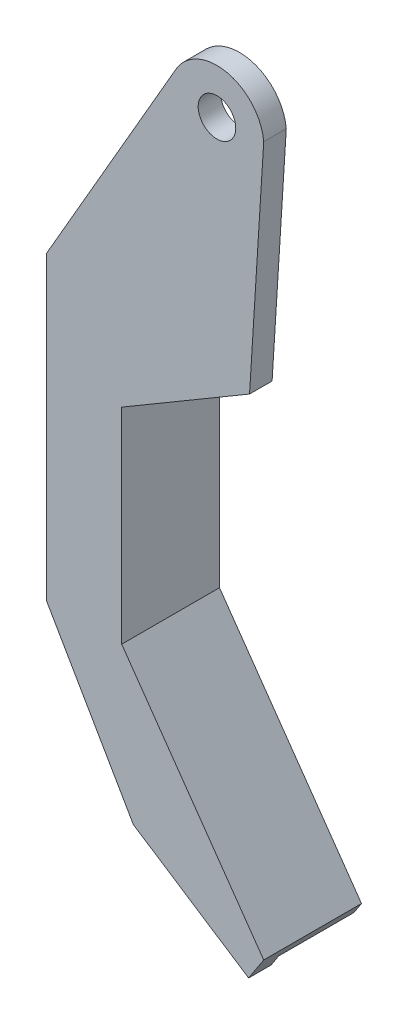
ISO-10303-21;
HEADER;
FILE_DESCRIPTION(('STEP AP214'),'2;1');
FILE_NAME('part.step','',(''),(''),'','','');
FILE_SCHEMA(('AUTOMOTIVE_DESIGN { 1 0 10303 214 1 1 1 1 }'));
ENDSEC;
DATA;
#1=APPLICATION_CONTEXT('core data for automotive mechanical design processes');
#2=APPLICATION_PROTOCOL_DEFINITION('international standard','automotive_design',2000,#1);
#3=PRODUCT_CONTEXT('',#1,'mechanical');
#4=PRODUCT('Part','Part','',(#3));
#5=PRODUCT_RELATED_PRODUCT_CATEGORY('part','',(#4));
#6=PRODUCT_DEFINITION_FORMATION('','',#4);
#7=PRODUCT_DEFINITION_CONTEXT('part definition',#1,'design');
#8=PRODUCT_DEFINITION('design','',#6,#7);
#9=PRODUCT_DEFINITION_SHAPE('','',#8);
#10=(LENGTH_UNIT() NAMED_UNIT(*) SI_UNIT(.MILLI.,.METRE.));
#11=(NAMED_UNIT(*) PLANE_ANGLE_UNIT() SI_UNIT($,.RADIAN.));
#12=(NAMED_UNIT(*) SI_UNIT($,.STERADIAN.) SOLID_ANGLE_UNIT());
#13=UNCERTAINTY_MEASURE_WITH_UNIT(LENGTH_MEASURE(1.E-05),#10,'distance_accuracy_value','');
#14=(GEOMETRIC_REPRESENTATION_CONTEXT(3) GLOBAL_UNCERTAINTY_ASSIGNED_CONTEXT((#13)) GLOBAL_UNIT_ASSIGNED_CONTEXT((#10,
#11,#12)) REPRESENTATION_CONTEXT('',''));
#15=CARTESIAN_POINT('',(0.,0.,0.));
#16=DIRECTION('',(0.,0.,1.));
#17=DIRECTION('',(1.,0.,0.));
#18=AXIS2_PLACEMENT_3D('',#15,#16,#17);
#19=CARTESIAN_POINT('',(0.,0.,0.));
#20=DIRECTION('',(0.,0.,1.));
#21=DIRECTION('',(1.,0.,0.));
#22=AXIS2_PLACEMENT_3D('',#19,#20,#21);
#23=PLANE('',#22);
#24=CARTESIAN_POINT('',(5.7844226517787,63.8812301614218,0.));
#25=DIRECTION('',(0.,0.,1.));
#26=DIRECTION('',(1.,0.,0.));
#27=AXIS2_PLACEMENT_3D('',#24,#25,#26);
#28=CIRCLE('',#27,2.5);
#29=CARTESIAN_POINT('',(8.2844226517787,63.8812301614218,0.));
#30=VERTEX_POINT('',#29);
#31=EDGE_CURVE('E181',#30,#30,#28,.T.);
#32=ORIENTED_EDGE('',*,*,#31,.T.);
#33=EDGE_LOOP('',(#32));
#34=FACE_BOUND('',#33,.T.);
#35=DIRECTION('',(1.,0.,0.));
#36=VECTOR('',#35,1.);
#37=CARTESIAN_POINT('',(-6.87917542036836,24.1907020152488,0.));
#38=LINE('',#37,#36);
#39=CARTESIAN_POINT('',(-8.24840054145359,24.1907020152488,0.));
#40=VERTEX_POINT('',#39);
#41=CARTESIAN_POINT('',(-6.87917542036836,24.1907020152488,0.));
#42=VERTEX_POINT('',#41);
#43=EDGE_CURVE('E51',#40,#42,#38,.T.);
#44=ORIENTED_EDGE('',*,*,#43,.F.);
#45=DIRECTION('',(0.,1.,0.));
#46=VECTOR('',#45,1.);
#47=CARTESIAN_POINT('',(-8.24840054145359,24.1907020152488,0.));
#48=LINE('',#47,#46);
#49=CARTESIAN_POINT('',(-8.24840054145359,-3.14548496619693,0.));
#50=VERTEX_POINT('',#49);
#51=EDGE_CURVE('E159',#50,#40,#48,.T.);
#52=ORIENTED_EDGE('',*,*,#51,.F.);
#53=DIRECTION('',(-0.560666801625377,0.828041507145125,0.));
#54=VECTOR('',#53,1.);
#55=CARTESIAN_POINT('',(-8.24840054145359,-3.14548496619693,0.));
#56=LINE('',#55,#54);
#57=CARTESIAN_POINT('',(10.9962486454122,-31.5676570494642,0.));
#58=VERTEX_POINT('',#57);
#59=EDGE_CURVE('E57',#58,#50,#56,.T.);
#60=ORIENTED_EDGE('',*,*,#59,.F.);
#61=DIRECTION('',(-0.546478346859033,-0.837473233252394,0.));
#62=VECTOR('',#61,1.);
#63=CARTESIAN_POINT('',(22.1596296407588,-14.4598744082376,0.));
#64=LINE('',#63,#62);
#65=CARTESIAN_POINT('',(9.99274151876576,-33.1055228455654,0.));
#66=VERTEX_POINT('',#65);
#67=EDGE_CURVE('E224',#58,#66,#64,.T.);
#68=ORIENTED_EDGE('',*,*,#67,.T.);
#69=DIRECTION('',(0.837473233252394,-0.546478346859033,0.));
#70=VECTOR('',#69,1.);
#71=CARTESIAN_POINT('',(-12.166888121993,-18.6456484373278,0.));
#72=LINE('',#71,#70);
#73=CARTESIAN_POINT('',(-5.3321700365758,-23.1055228455654,0.));
#74=VERTEX_POINT('',#73);
#75=EDGE_CURVE('E221',#74,#66,#72,.T.);
#76=ORIENTED_EDGE('',*,*,#75,.F.);
#77=DIRECTION('',(0.500000000000001,-0.866025403784438,0.));
#78=VECTOR('',#77,1.);
#79=CARTESIAN_POINT('',(-14.0041124034225,-8.08527806587781,0.));
#80=LINE('',#79,#78);
#81=CARTESIAN_POINT('',(-16.8791754203684,-3.10552284556541,0.));
#82=VERTEX_POINT('',#81);
#83=EDGE_CURVE('E219',#82,#74,#80,.T.);
#84=ORIENTED_EDGE('',*,*,#83,.F.);
#85=DIRECTION('',(0.,-1.,0.));
#86=VECTOR('',#85,1.);
#87=CARTESIAN_POINT('',(-16.8791754203684,0.,0.));
#88=LINE('',#87,#86);
#89=CARTESIAN_POINT('',(-16.8791754203684,36.8944771544346,0.));
#90=VERTEX_POINT('',#89);
#91=EDGE_CURVE('E217',#90,#82,#88,.T.);
#92=ORIENTED_EDGE('',*,*,#91,.F.);
#93=DIRECTION('',(-0.500000000000001,-0.866025403784438,0.));
#94=VECTOR('',#93,1.);
#95=CARTESIAN_POINT('',(-28.6351588028188,16.5325166430951,0.));
#96=LINE('',#95,#94);
#97=CARTESIAN_POINT('',(0.441332655320446,66.8944771544346,0.));
#98=VERTEX_POINT('',#97);
#99=EDGE_CURVE('E215',#98,#90,#96,.T.);
#100=ORIENTED_EDGE('',*,*,#99,.F.);
#101=CARTESIAN_POINT('',(5.76690652211303,63.6033246271349,0.));
#102=DIRECTION('',(0.,0.,1.));
#103=DIRECTION('',(1.,0.,0.));
#104=AXIS2_PLACEMENT_3D('',#101,#102,#103);
#105=CIRCLE('',#104,6.26046499619758);
#106=CARTESIAN_POINT('',(11.9997557720586,64.1907020152488,0.));
#107=VERTEX_POINT('',#106);
#108=EDGE_CURVE('E185',#98,#107,#105,.F.);
#109=ORIENTED_EDGE('',*,*,#108,.T.);
#110=DIRECTION('',(-0.0627236800306548,-0.998030931366063,0.));
#111=VECTOR('',#110,1.);
#112=CARTESIAN_POINT('',(7.93419657418711,-0.498643871225965,0.));
#113=LINE('',#112,#111);
#114=CARTESIAN_POINT('',(10.1143328439896,34.1907020152488,0.));
#115=VERTEX_POINT('',#114);
#116=EDGE_CURVE('E192',#107,#115,#113,.T.);
#117=ORIENTED_EDGE('',*,*,#116,.T.);
#118=DIRECTION('',(-0.861849566268666,-0.507164002195062,0.));
#119=VECTOR('',#118,1.);
#120=CARTESIAN_POINT('',(-12.343162824505,20.9753639466543,0.));
#121=LINE('',#120,#119);
#122=EDGE_CURVE('E226',#115,#42,#121,.T.);
#123=ORIENTED_EDGE('',*,*,#122,.T.);
#124=EDGE_LOOP('',(#44,#52,#60,#68,#76,#84,#92,#100,#109,#117,#123));
#125=FACE_BOUND('',#124,.T.);
#126=ADVANCED_FACE('F36',(#34,#125),#23,.F.);
#127=CARTESIAN_POINT('',(5.76690652211303,63.6033246271349,3.));
#128=DIRECTION('',(0.,0.,-1.));
#129=DIRECTION('',(-1.,0.,0.));
#130=AXIS2_PLACEMENT_3D('',#127,#128,#129);
#131=CYLINDRICAL_SURFACE('',#130,6.26046499619758);
#132=ORIENTED_EDGE('',*,*,#108,.F.);
#133=DIRECTION('',(0.,0.,-1.));
#134=VECTOR('',#133,1.);
#135=CARTESIAN_POINT('',(0.441332655320446,66.8944771544346,3.));
#136=LINE('',#135,#134);
#137=CARTESIAN_POINT('',(0.441332655320446,66.8944771544346,3.));
#138=VERTEX_POINT('',#137);
#139=EDGE_CURVE('E11',#138,#98,#136,.T.);
#140=ORIENTED_EDGE('',*,*,#139,.F.);
#141=CARTESIAN_POINT('',(5.76690652211303,63.6033246271349,3.));
#142=DIRECTION('',(0.,0.,1.));
#143=DIRECTION('',(1.,0.,0.));
#144=AXIS2_PLACEMENT_3D('',#141,#142,#143);
#145=CIRCLE('',#144,6.26046499619758);
#146=CARTESIAN_POINT('',(11.9997557720586,64.1907020152488,3.));
#147=VERTEX_POINT('',#146);
#148=EDGE_CURVE('E188',#138,#147,#145,.F.);
#149=ORIENTED_EDGE('',*,*,#148,.T.);
#150=DIRECTION('',(0.,0.,-1.));
#151=VECTOR('',#150,1.);
#152=CARTESIAN_POINT('',(11.9997557720586,64.1907020152488,3.));
#153=LINE('',#152,#151);
#154=EDGE_CURVE('E212',#147,#107,#153,.T.);
#155=ORIENTED_EDGE('',*,*,#154,.T.);
#156=EDGE_LOOP('',(#132,#140,#149,#155));
#157=FACE_BOUND('',#156,.T.);
#158=ADVANCED_FACE('F38',(#157),#131,.T.);
#159=CARTESIAN_POINT('',(-28.6351588028188,16.5325166430951,3.));
#160=DIRECTION('',(0.866025403784438,-0.500000000000001,0.));
#161=DIRECTION('',(0.500000000000001,0.866025403784438,0.));
#162=AXIS2_PLACEMENT_3D('',#159,#160,#161);
#163=PLANE('',#162);
#164=ORIENTED_EDGE('',*,*,#99,.T.);
#165=DIRECTION('',(0.,0.,-1.));
#166=VECTOR('',#165,1.);
#167=CARTESIAN_POINT('',(-16.8791754203684,36.8944771544346,3.));
#168=LINE('',#167,#166);
#169=CARTESIAN_POINT('',(-16.8791754203684,36.8944771544346,3.));
#170=VERTEX_POINT('',#169);
#171=EDGE_CURVE('E44',#170,#90,#168,.T.);
#172=ORIENTED_EDGE('',*,*,#171,.F.);
#173=DIRECTION('',(-0.500000000000001,-0.866025403784438,0.));
#174=VECTOR('',#173,1.);
#175=CARTESIAN_POINT('',(-28.6351588028188,16.5325166430951,3.));
#176=LINE('',#175,#174);
#177=EDGE_CURVE('E191',#138,#170,#176,.T.);
#178=ORIENTED_EDGE('',*,*,#177,.F.);
#179=ORIENTED_EDGE('',*,*,#139,.T.);
#180=EDGE_LOOP('',(#164,#172,#178,#179));
#181=FACE_BOUND('',#180,.T.);
#182=ADVANCED_FACE('F269',(#181),#163,.F.);
#183=CARTESIAN_POINT('',(-16.8791754203684,0.,3.));
#184=DIRECTION('',(1.,0.,0.));
#185=DIRECTION('',(0.,1.,0.));
#186=AXIS2_PLACEMENT_3D('',#183,#184,#185);
#187=PLANE('',#186);
#188=ORIENTED_EDGE('',*,*,#91,.T.);
#189=DIRECTION('',(0.,0.,-1.));
#190=VECTOR('',#189,1.);
#191=CARTESIAN_POINT('',(-16.8791754203684,-3.10552284556541,3.));
#192=LINE('',#191,#190);
#193=CARTESIAN_POINT('',(-16.8791754203684,-3.10552284556541,3.));
#194=VERTEX_POINT('',#193);
#195=EDGE_CURVE('E241',#194,#82,#192,.T.);
#196=ORIENTED_EDGE('',*,*,#195,.F.);
#197=DIRECTION('',(0.,-1.,0.));
#198=VECTOR('',#197,1.);
#199=CARTESIAN_POINT('',(-16.8791754203684,0.,3.));
#200=LINE('',#199,#198);
#201=EDGE_CURVE('E194',#170,#194,#200,.T.);
#202=ORIENTED_EDGE('',*,*,#201,.F.);
#203=ORIENTED_EDGE('',*,*,#171,.T.);
#204=EDGE_LOOP('',(#188,#196,#202,#203));
#205=FACE_BOUND('',#204,.T.);
#206=ADVANCED_FACE('F248',(#205),#187,.F.);
#207=CARTESIAN_POINT('',(-14.0041124034225,-8.08527806587781,3.));
#208=DIRECTION('',(0.866025403784438,0.500000000000001,0.));
#209=DIRECTION('',(-0.500000000000001,0.866025403784438,0.));
#210=AXIS2_PLACEMENT_3D('',#207,#208,#209);
#211=PLANE('',#210);
#212=ORIENTED_EDGE('',*,*,#83,.T.);
#213=DIRECTION('',(0.,0.,-1.));
#214=VECTOR('',#213,1.);
#215=CARTESIAN_POINT('',(-5.3321700365758,-23.1055228455654,3.));
#216=LINE('',#215,#214);
#217=CARTESIAN_POINT('',(-5.3321700365758,-23.1055228455654,3.));
#218=VERTEX_POINT('',#217);
#219=EDGE_CURVE('E238',#218,#74,#216,.T.);
#220=ORIENTED_EDGE('',*,*,#219,.F.);
#221=DIRECTION('',(0.500000000000001,-0.866025403784438,0.));
#222=VECTOR('',#221,1.);
#223=CARTESIAN_POINT('',(-14.0041124034225,-8.08527806587781,3.));
#224=LINE('',#223,#222);
#225=EDGE_CURVE('E196',#194,#218,#224,.T.);
#226=ORIENTED_EDGE('',*,*,#225,.F.);
#227=ORIENTED_EDGE('',*,*,#195,.T.);
#228=EDGE_LOOP('',(#212,#220,#226,#227));
#229=FACE_BOUND('',#228,.T.);
#230=ADVANCED_FACE('F258',(#229),#211,.F.);
#231=CARTESIAN_POINT('',(-12.166888121993,-18.6456484373278,3.));
#232=DIRECTION('',(0.546478346859033,0.837473233252394,0.));
#233=DIRECTION('',(-0.837473233252394,0.546478346859033,0.));
#234=AXIS2_PLACEMENT_3D('',#231,#232,#233);
#235=PLANE('',#234);
#236=ORIENTED_EDGE('',*,*,#75,.T.);
#237=DIRECTION('',(0.,0.,-1.));
#238=VECTOR('',#237,1.);
#239=CARTESIAN_POINT('',(9.99274151876576,-33.1055228455654,3.));
#240=LINE('',#239,#238);
#241=CARTESIAN_POINT('',(9.99274151876576,-33.1055228455654,3.));
#242=VERTEX_POINT('',#241);
#243=EDGE_CURVE('E235',#242,#66,#240,.T.);
#244=ORIENTED_EDGE('',*,*,#243,.F.);
#245=DIRECTION('',(0.837473233252394,-0.546478346859033,0.));
#246=VECTOR('',#245,1.);
#247=CARTESIAN_POINT('',(-12.166888121993,-18.6456484373278,3.));
#248=LINE('',#247,#246);
#249=EDGE_CURVE('E198',#218,#242,#248,.T.);
#250=ORIENTED_EDGE('',*,*,#249,.F.);
#251=ORIENTED_EDGE('',*,*,#219,.T.);
#252=EDGE_LOOP('',(#236,#244,#250,#251));
#253=FACE_BOUND('',#252,.T.);
#254=ADVANCED_FACE('F262',(#253),#235,.F.);
#255=CARTESIAN_POINT('',(22.1596296407588,-14.4598744082376,3.));
#256=DIRECTION('',(0.837473233252394,-0.546478346859033,0.));
#257=DIRECTION('',(0.546478346859033,0.837473233252394,0.));
#258=AXIS2_PLACEMENT_3D('',#255,#256,#257);
#259=PLANE('',#258);
#260=ORIENTED_EDGE('',*,*,#67,.F.);
#261=DIRECTION('',(0.,0.,1.));
#262=VECTOR('',#261,1.);
#263=CARTESIAN_POINT('',(10.9962486454122,-31.5676570494642,-10.));
#264=LINE('',#263,#262);
#265=CARTESIAN_POINT('',(10.9962486454122,-31.5676570494642,-10.));
#266=VERTEX_POINT('',#265);
#267=EDGE_CURVE('E178',#266,#58,#264,.T.);
#268=ORIENTED_EDGE('',*,*,#267,.F.);
#269=DIRECTION('',(-0.546478346859031,-0.837473233252395,0.));
#270=VECTOR('',#269,1.);
#271=CARTESIAN_POINT('',(11.9997557720586,-30.0297912533631,-10.));
#272=LINE('',#271,#270);
#273=CARTESIAN_POINT('',(11.9997557720586,-30.0297912533631,-10.));
#274=VERTEX_POINT('',#273);
#275=EDGE_CURVE('E152',#274,#266,#272,.T.);
#276=ORIENTED_EDGE('',*,*,#275,.F.);
#277=DIRECTION('',(0.,0.,-1.));
#278=VECTOR('',#277,1.);
#279=CARTESIAN_POINT('',(11.9997557720586,-30.0297912533631,3.));
#280=LINE('',#279,#278);
#281=CARTESIAN_POINT('',(11.9997557720586,-30.0297912533631,3.));
#282=VERTEX_POINT('',#281);
#283=EDGE_CURVE('E144',#282,#274,#280,.T.);
#284=ORIENTED_EDGE('',*,*,#283,.F.);
#285=DIRECTION('',(-0.546478346859033,-0.837473233252394,0.));
#286=VECTOR('',#285,1.);
#287=CARTESIAN_POINT('',(22.1596296407588,-14.4598744082376,3.));
#288=LINE('',#287,#286);
#289=EDGE_CURVE('E200',#282,#242,#288,.T.);
#290=ORIENTED_EDGE('',*,*,#289,.T.);
#291=ORIENTED_EDGE('',*,*,#243,.T.);
#292=EDGE_LOOP('',(#260,#268,#276,#284,#290,#291));
#293=FACE_BOUND('',#292,.T.);
#294=ADVANCED_FACE('F290',(#293),#259,.T.);
#295=CARTESIAN_POINT('',(-6.07156547642134,-4.25729921881468,3.));
#296=DIRECTION('',(0.818775295962723,0.574114112978556,0.));
#297=DIRECTION('',(-0.574114112978556,0.818775295962724,0.));
#298=AXIS2_PLACEMENT_3D('',#295,#296,#297);
#299=PLANE('',#298);
#300=ORIENTED_EDGE('',*,*,#283,.T.);
#301=DIRECTION('',(0.574114112978556,-0.818775295962724,0.));
#302=VECTOR('',#301,1.);
#303=CARTESIAN_POINT('',(-6.87917542036836,-3.10552284556541,-10.));
#304=LINE('',#303,#302);
#305=CARTESIAN_POINT('',(-6.87917542036836,-3.10552284556541,-10.));
#306=VERTEX_POINT('',#305);
#307=EDGE_CURVE('E148',#306,#274,#304,.T.);
#308=ORIENTED_EDGE('',*,*,#307,.F.);
#309=DIRECTION('',(0.,0.,-1.));
#310=VECTOR('',#309,1.);
#311=CARTESIAN_POINT('',(-6.87917542036836,-3.10552284556541,3.));
#312=LINE('',#311,#310);
#313=CARTESIAN_POINT('',(-6.87917542036836,-3.10552284556541,3.));
#314=VERTEX_POINT('',#313);
#315=EDGE_CURVE('E133',#314,#306,#312,.T.);
#316=ORIENTED_EDGE('',*,*,#315,.F.);
#317=DIRECTION('',(0.574114112978556,-0.818775295962724,0.));
#318=VECTOR('',#317,1.);
#319=CARTESIAN_POINT('',(-6.07156547642134,-4.25729921881468,3.));
#320=LINE('',#319,#318);
#321=EDGE_CURVE('E203',#314,#282,#320,.T.);
#322=ORIENTED_EDGE('',*,*,#321,.T.);
#323=EDGE_LOOP('',(#300,#308,#316,#322));
#324=FACE_BOUND('',#323,.T.);
#325=ADVANCED_FACE('F149',(#324),#299,.T.);
#326=CARTESIAN_POINT('',(-6.87917542036836,0.,3.));
#327=DIRECTION('',(1.,0.,0.));
#328=DIRECTION('',(0.,1.,0.));
#329=AXIS2_PLACEMENT_3D('',#326,#327,#328);
#330=PLANE('',#329);
#331=ORIENTED_EDGE('',*,*,#315,.T.);
#332=DIRECTION('',(0.,-1.,0.));
#333=VECTOR('',#332,1.);
#334=CARTESIAN_POINT('',(-6.87917542036836,24.1907020152488,-10.));
#335=LINE('',#334,#333);
#336=CARTESIAN_POINT('',(-6.87917542036836,24.1907020152488,-10.));
#337=VERTEX_POINT('',#336);
#338=EDGE_CURVE('E138',#337,#306,#335,.T.);
#339=ORIENTED_EDGE('',*,*,#338,.F.);
#340=DIRECTION('',(0.,0.,1.));
#341=VECTOR('',#340,1.);
#342=CARTESIAN_POINT('',(-6.87917542036836,24.1907020152488,-10.));
#343=LINE('',#342,#341);
#344=EDGE_CURVE('E168',#337,#42,#343,.T.);
#345=ORIENTED_EDGE('',*,*,#344,.T.);
#346=DIRECTION('',(0.,0.,-1.));
#347=VECTOR('',#346,1.);
#348=CARTESIAN_POINT('',(-6.87917542036836,24.1907020152488,3.));
#349=LINE('',#348,#347);
#350=CARTESIAN_POINT('',(-6.87917542036836,24.1907020152488,3.));
#351=VERTEX_POINT('',#350);
#352=EDGE_CURVE('E145',#351,#42,#349,.T.);
#353=ORIENTED_EDGE('',*,*,#352,.F.);
#354=DIRECTION('',(0.,-1.,0.));
#355=VECTOR('',#354,1.);
#356=CARTESIAN_POINT('',(-6.87917542036836,0.,3.));
#357=LINE('',#356,#355);
#358=EDGE_CURVE('E140',#351,#314,#357,.T.);
#359=ORIENTED_EDGE('',*,*,#358,.T.);
#360=EDGE_LOOP('',(#331,#339,#345,#353,#359));
#361=FACE_BOUND('',#360,.T.);
#362=ADVANCED_FACE('F135',(#361),#330,.T.);
#363=CARTESIAN_POINT('',(-12.343162824505,20.9753639466543,3.));
#364=DIRECTION('',(0.507164002195062,-0.861849566268666,0.));
#365=DIRECTION('',(0.861849566268666,0.507164002195062,0.));
#366=AXIS2_PLACEMENT_3D('',#363,#364,#365);
#367=PLANE('',#366);
#368=ORIENTED_EDGE('',*,*,#122,.F.);
#369=DIRECTION('',(0.,0.,-1.));
#370=VECTOR('',#369,1.);
#371=CARTESIAN_POINT('',(10.1143328439896,34.1907020152488,3.));
#372=LINE('',#371,#370);
#373=CARTESIAN_POINT('',(10.1143328439896,34.1907020152488,3.));
#374=VERTEX_POINT('',#373);
#375=EDGE_CURVE('E231',#374,#115,#372,.T.);
#376=ORIENTED_EDGE('',*,*,#375,.F.);
#377=DIRECTION('',(-0.861849566268666,-0.507164002195062,0.));
#378=VECTOR('',#377,1.);
#379=CARTESIAN_POINT('',(-12.343162824505,20.9753639466543,3.));
#380=LINE('',#379,#378);
#381=EDGE_CURVE('E206',#374,#351,#380,.T.);
#382=ORIENTED_EDGE('',*,*,#381,.T.);
#383=ORIENTED_EDGE('',*,*,#352,.T.);
#384=EDGE_LOOP('',(#368,#376,#382,#383));
#385=FACE_BOUND('',#384,.T.);
#386=ADVANCED_FACE('F277',(#385),#367,.T.);
#387=CARTESIAN_POINT('',(7.93419657418711,-0.498643871225965,3.));
#388=DIRECTION('',(0.998030931366063,-0.0627236800306548,0.));
#389=DIRECTION('',(0.0627236800306548,0.998030931366064,0.));
#390=AXIS2_PLACEMENT_3D('',#387,#388,#389);
#391=PLANE('',#390);
#392=ORIENTED_EDGE('',*,*,#116,.F.);
#393=ORIENTED_EDGE('',*,*,#154,.F.);
#394=DIRECTION('',(-0.0627236800306548,-0.998030931366063,0.));
#395=VECTOR('',#394,1.);
#396=CARTESIAN_POINT('',(7.93419657418711,-0.498643871225965,3.));
#397=LINE('',#396,#395);
#398=EDGE_CURVE('E209',#147,#374,#397,.T.);
#399=ORIENTED_EDGE('',*,*,#398,.T.);
#400=ORIENTED_EDGE('',*,*,#375,.T.);
#401=EDGE_LOOP('',(#392,#393,#399,#400));
#402=FACE_BOUND('',#401,.T.);
#403=ADVANCED_FACE('F273',(#402),#391,.T.);
#404=CARTESIAN_POINT('',(0.,0.,3.));
#405=DIRECTION('',(0.,0.,1.));
#406=DIRECTION('',(1.,0.,0.));
#407=AXIS2_PLACEMENT_3D('',#404,#405,#406);
#408=PLANE('',#407);
#409=CARTESIAN_POINT('',(5.7844226517787,63.8812301614218,3.));
#410=DIRECTION('',(0.,0.,1.));
#411=DIRECTION('',(1.,0.,0.));
#412=AXIS2_PLACEMENT_3D('',#409,#410,#411);
#413=CIRCLE('',#412,2.5);
#414=CARTESIAN_POINT('',(8.2844226517787,63.8812301614218,3.));
#415=VERTEX_POINT('',#414);
#416=EDGE_CURVE('E182',#415,#415,#413,.T.);
#417=ORIENTED_EDGE('',*,*,#416,.F.);
#418=EDGE_LOOP('',(#417));
#419=FACE_BOUND('',#418,.T.);
#420=ORIENTED_EDGE('',*,*,#148,.F.);
#421=ORIENTED_EDGE('',*,*,#177,.T.);
#422=ORIENTED_EDGE('',*,*,#201,.T.);
#423=ORIENTED_EDGE('',*,*,#225,.T.);
#424=ORIENTED_EDGE('',*,*,#249,.T.);
#425=ORIENTED_EDGE('',*,*,#289,.F.);
#426=ORIENTED_EDGE('',*,*,#321,.F.);
#427=ORIENTED_EDGE('',*,*,#358,.F.);
#428=ORIENTED_EDGE('',*,*,#381,.F.);
#429=ORIENTED_EDGE('',*,*,#398,.F.);
#430=EDGE_LOOP('',(#420,#421,#422,#423,#424,#425,#426,#427,#428,#429));
#431=FACE_BOUND('',#430,.T.);
#432=ADVANCED_FACE('F267',(#419,#431),#408,.T.);
#433=CARTESIAN_POINT('',(5.7844226517787,63.8812301614218,3.));
#434=DIRECTION('',(0.,0.,-1.));
#435=DIRECTION('',(-1.,0.,0.));
#436=AXIS2_PLACEMENT_3D('',#433,#434,#435);
#437=CYLINDRICAL_SURFACE('',#436,2.5);
#438=ORIENTED_EDGE('',*,*,#416,.T.);
#439=EDGE_LOOP('',(#438));
#440=FACE_BOUND('',#439,.T.);
#441=ORIENTED_EDGE('',*,*,#31,.F.);
#442=EDGE_LOOP('',(#441));
#443=FACE_BOUND('',#442,.T.);
#444=ADVANCED_FACE('F333',(#440,#443),#437,.F.);
#445=CARTESIAN_POINT('',(-8.24840054145359,-3.14548496619693,-10.));
#446=DIRECTION('',(0.828041507145125,0.560666801625377,0.));
#447=DIRECTION('',(-0.560666801625377,0.828041507145125,0.));
#448=AXIS2_PLACEMENT_3D('',#445,#446,#447);
#449=PLANE('',#448);
#450=ORIENTED_EDGE('',*,*,#59,.T.);
#451=DIRECTION('',(0.,0.,1.));
#452=VECTOR('',#451,1.);
#453=CARTESIAN_POINT('',(-8.24840054145359,-3.14548496619693,-10.));
#454=LINE('',#453,#452);
#455=CARTESIAN_POINT('',(-8.24840054145359,-3.14548496619693,-10.));
#456=VERTEX_POINT('',#455);
#457=EDGE_CURVE('E175',#456,#50,#454,.T.);
#458=ORIENTED_EDGE('',*,*,#457,.F.);
#459=DIRECTION('',(-0.560666801625377,0.828041507145125,0.));
#460=VECTOR('',#459,1.);
#461=CARTESIAN_POINT('',(-8.24840054145359,-3.14548496619693,-10.));
#462=LINE('',#461,#460);
#463=EDGE_CURVE('E163',#266,#456,#462,.T.);
#464=ORIENTED_EDGE('',*,*,#463,.F.);
#465=ORIENTED_EDGE('',*,*,#267,.T.);
#466=EDGE_LOOP('',(#450,#458,#464,#465));
#467=FACE_BOUND('',#466,.T.);
#468=ADVANCED_FACE('F286',(#467),#449,.F.);
#469=CARTESIAN_POINT('',(-8.24840054145359,24.1907020152488,-10.));
#470=DIRECTION('',(1.,0.,0.));
#471=DIRECTION('',(0.,0.,-1.));
#472=AXIS2_PLACEMENT_3D('',#469,#470,#471);
#473=PLANE('',#472);
#474=ORIENTED_EDGE('',*,*,#51,.T.);
#475=DIRECTION('',(0.,0.,1.));
#476=VECTOR('',#475,1.);
#477=CARTESIAN_POINT('',(-8.24840054145359,24.1907020152488,-10.));
#478=LINE('',#477,#476);
#479=CARTESIAN_POINT('',(-8.24840054145359,24.1907020152488,-10.));
#480=VERTEX_POINT('',#479);
#481=EDGE_CURVE('E172',#480,#40,#478,.T.);
#482=ORIENTED_EDGE('',*,*,#481,.F.);
#483=DIRECTION('',(0.,1.,0.));
#484=VECTOR('',#483,1.);
#485=CARTESIAN_POINT('',(-8.24840054145359,24.1907020152488,-10.));
#486=LINE('',#485,#484);
#487=EDGE_CURVE('E165',#456,#480,#486,.T.);
#488=ORIENTED_EDGE('',*,*,#487,.F.);
#489=ORIENTED_EDGE('',*,*,#457,.T.);
#490=EDGE_LOOP('',(#474,#482,#488,#489));
#491=FACE_BOUND('',#490,.T.);
#492=ADVANCED_FACE('F283',(#491),#473,.F.);
#493=CARTESIAN_POINT('',(-6.87917542036836,24.1907020152488,-10.));
#494=DIRECTION('',(0.,-1.,0.));
#495=DIRECTION('',(0.,0.,-1.));
#496=AXIS2_PLACEMENT_3D('',#493,#494,#495);
#497=PLANE('',#496);
#498=ORIENTED_EDGE('',*,*,#43,.T.);
#499=ORIENTED_EDGE('',*,*,#344,.F.);
#500=DIRECTION('',(1.,0.,0.));
#501=VECTOR('',#500,1.);
#502=CARTESIAN_POINT('',(-6.87917542036836,24.1907020152488,-10.));
#503=LINE('',#502,#501);
#504=EDGE_CURVE('E156',#480,#337,#503,.T.);
#505=ORIENTED_EDGE('',*,*,#504,.F.);
#506=ORIENTED_EDGE('',*,*,#481,.T.);
#507=EDGE_LOOP('',(#498,#499,#505,#506));
#508=FACE_BOUND('',#507,.T.);
#509=ADVANCED_FACE('F279',(#508),#497,.F.);
#510=CARTESIAN_POINT('',(0.,0.,-10.));
#511=DIRECTION('',(0.,0.,-1.));
#512=DIRECTION('',(-1.,0.,0.));
#513=AXIS2_PLACEMENT_3D('',#510,#511,#512);
#514=PLANE('',#513);
#515=ORIENTED_EDGE('',*,*,#338,.T.);
#516=ORIENTED_EDGE('',*,*,#307,.T.);
#517=ORIENTED_EDGE('',*,*,#275,.T.);
#518=ORIENTED_EDGE('',*,*,#463,.T.);
#519=ORIENTED_EDGE('',*,*,#487,.T.);
#520=ORIENTED_EDGE('',*,*,#504,.T.);
#521=EDGE_LOOP('',(#515,#516,#517,#518,#519,#520));
#522=FACE_BOUND('',#521,.T.);
#523=ADVANCED_FACE('F154',(#522),#514,.T.);
#524=CLOSED_SHELL('',(#126,#158,#182,#206,#230,#254,#294,#325,#362,#386,#403,#432,#444,#468,
#492,#509,#523));
#525=MANIFOLD_SOLID_BREP('B2',#524);
#526=ADVANCED_BREP_SHAPE_REPRESENTATION('',(#18,#525),#14);
#527=SHAPE_DEFINITION_REPRESENTATION(#9,#526);
ENDSEC;
END-ISO-10303-21;
